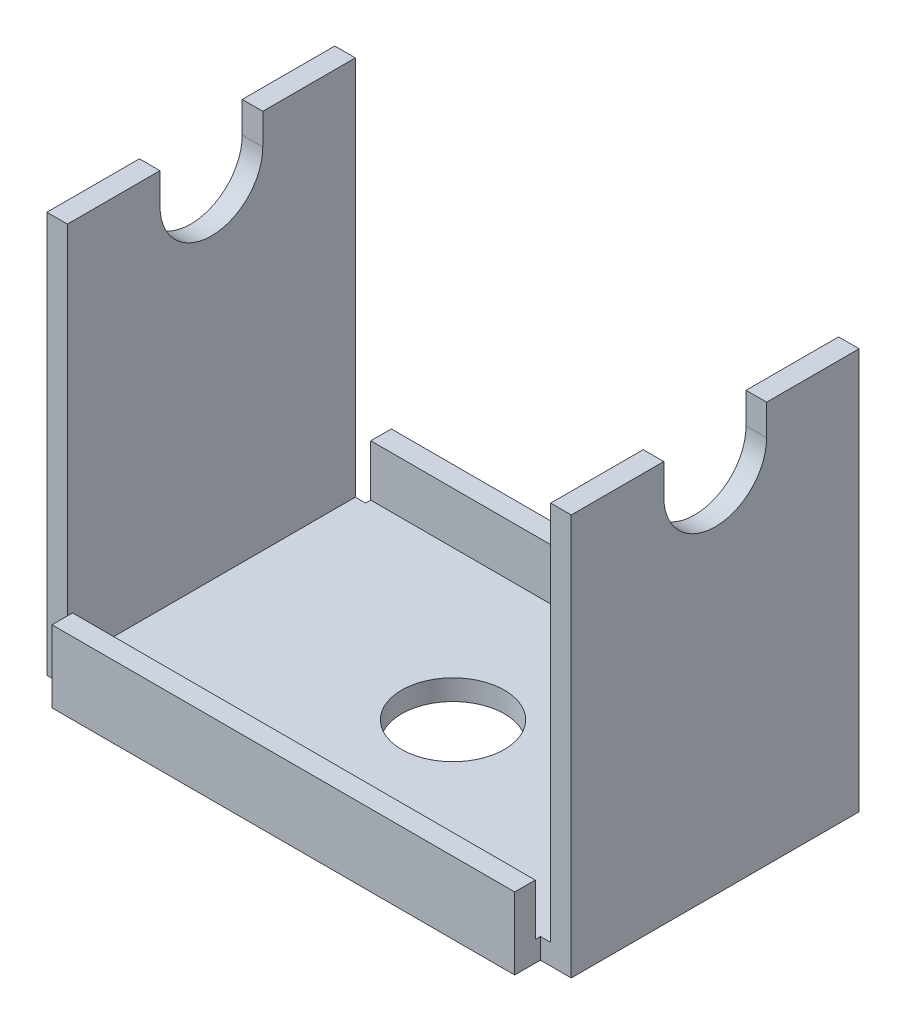
ISO-10303-21;
HEADER;
FILE_DESCRIPTION(('STEP AP214'),'2;1');
FILE_NAME('part.step','',(''),(''),'','','');
FILE_SCHEMA(('AUTOMOTIVE_DESIGN { 1 0 10303 214 1 1 1 1 }'));
ENDSEC;
DATA;
#1=APPLICATION_CONTEXT('core data for automotive mechanical design processes');
#2=APPLICATION_PROTOCOL_DEFINITION('international standard','automotive_design',2000,#1);
#3=PRODUCT_CONTEXT('',#1,'mechanical');
#4=PRODUCT('Part','Part','',(#3));
#5=PRODUCT_RELATED_PRODUCT_CATEGORY('part','',(#4));
#6=PRODUCT_DEFINITION_FORMATION('','',#4);
#7=PRODUCT_DEFINITION_CONTEXT('part definition',#1,'design');
#8=PRODUCT_DEFINITION('design','',#6,#7);
#9=PRODUCT_DEFINITION_SHAPE('','',#8);
#10=(LENGTH_UNIT() NAMED_UNIT(*) SI_UNIT(.MILLI.,.METRE.));
#11=(NAMED_UNIT(*) PLANE_ANGLE_UNIT() SI_UNIT($,.RADIAN.));
#12=(NAMED_UNIT(*) SI_UNIT($,.STERADIAN.) SOLID_ANGLE_UNIT());
#13=UNCERTAINTY_MEASURE_WITH_UNIT(LENGTH_MEASURE(1.E-05),#10,'distance_accuracy_value','');
#14=(GEOMETRIC_REPRESENTATION_CONTEXT(3) GLOBAL_UNCERTAINTY_ASSIGNED_CONTEXT((#13)) GLOBAL_UNIT_ASSIGNED_CONTEXT((#10,
#11,#12)) REPRESENTATION_CONTEXT('',''));
#15=CARTESIAN_POINT('',(0.,0.,0.));
#16=DIRECTION('',(0.,0.,1.));
#17=DIRECTION('',(1.,0.,0.));
#18=AXIS2_PLACEMENT_3D('',#15,#16,#17);
#19=CARTESIAN_POINT('',(-23.5,39.,-14.));
#20=DIRECTION('',(0.,1.,0.));
#21=DIRECTION('',(0.,0.,1.));
#22=AXIS2_PLACEMENT_3D('',#19,#20,#21);
#23=PLANE('',#22);
#24=DIRECTION('',(1.,0.,0.));
#25=VECTOR('',#24,1.);
#26=CARTESIAN_POINT('',(-25.500025,39.,5.));
#27=LINE('',#26,#25);
#28=CARTESIAN_POINT('',(-25.5,39.,5.));
#29=VERTEX_POINT('',#28);
#30=CARTESIAN_POINT('',(-23.5,39.,5.));
#31=VERTEX_POINT('',#30);
#32=EDGE_CURVE('E513',#29,#31,#27,.T.);
#33=ORIENTED_EDGE('',*,*,#32,.F.);
#34=DIRECTION('',(0.,0.,1.));
#35=VECTOR('',#34,1.);
#36=CARTESIAN_POINT('',(-25.5,39.,-14.));
#37=LINE('',#36,#35);
#38=CARTESIAN_POINT('',(-25.5,39.,14.));
#39=VERTEX_POINT('',#38);
#40=EDGE_CURVE('E253',#29,#39,#37,.T.);
#41=ORIENTED_EDGE('',*,*,#40,.T.);
#42=DIRECTION('',(-1.,0.,0.));
#43=VECTOR('',#42,1.);
#44=CARTESIAN_POINT('',(-23.5,39.,14.));
#45=LINE('',#44,#43);
#46=CARTESIAN_POINT('',(-23.5,39.,14.));
#47=VERTEX_POINT('',#46);
#48=EDGE_CURVE('E267',#47,#39,#45,.T.);
#49=ORIENTED_EDGE('',*,*,#48,.F.);
#50=DIRECTION('',(0.,0.,1.));
#51=VECTOR('',#50,1.);
#52=CARTESIAN_POINT('',(-23.5,39.,-14.));
#53=LINE('',#52,#51);
#54=EDGE_CURVE('E305',#31,#47,#53,.T.);
#55=ORIENTED_EDGE('',*,*,#54,.F.);
#56=EDGE_LOOP('',(#33,#41,#49,#55));
#57=FACE_BOUND('',#56,.T.);
#58=ADVANCED_FACE('F31',(#57),#23,.T.);
#59=CARTESIAN_POINT('',(25.5,39.,-14.));
#60=DIRECTION('',(0.,1.,0.));
#61=DIRECTION('',(0.,0.,1.));
#62=AXIS2_PLACEMENT_3D('',#59,#60,#61);
#63=PLANE('',#62);
#64=CARTESIAN_POINT('',(23.5,39.,5.));
#65=VERTEX_POINT('',#64);
#66=CARTESIAN_POINT('',(25.5,39.,5.));
#67=VERTEX_POINT('',#66);
#68=EDGE_CURVE('E346',#65,#67,#27,.T.);
#69=ORIENTED_EDGE('',*,*,#68,.F.);
#70=DIRECTION('',(0.,0.,1.));
#71=VECTOR('',#70,1.);
#72=CARTESIAN_POINT('',(23.5,39.,-14.));
#73=LINE('',#72,#71);
#74=CARTESIAN_POINT('',(23.5,39.,14.));
#75=VERTEX_POINT('',#74);
#76=EDGE_CURVE('E297',#65,#75,#73,.T.);
#77=ORIENTED_EDGE('',*,*,#76,.T.);
#78=DIRECTION('',(-1.,0.,0.));
#79=VECTOR('',#78,1.);
#80=CARTESIAN_POINT('',(25.5,39.,14.));
#81=LINE('',#80,#79);
#82=CARTESIAN_POINT('',(25.5,39.,14.));
#83=VERTEX_POINT('',#82);
#84=EDGE_CURVE('E327',#83,#75,#81,.T.);
#85=ORIENTED_EDGE('',*,*,#84,.F.);
#86=DIRECTION('',(0.,0.,1.));
#87=VECTOR('',#86,1.);
#88=CARTESIAN_POINT('',(25.5,39.,-14.));
#89=LINE('',#88,#87);
#90=EDGE_CURVE('E293',#67,#83,#89,.T.);
#91=ORIENTED_EDGE('',*,*,#90,.F.);
#92=EDGE_LOOP('',(#69,#77,#85,#91));
#93=FACE_BOUND('',#92,.T.);
#94=ADVANCED_FACE('F344',(#93),#63,.T.);
#95=CARTESIAN_POINT('',(-25.5,39.,-14.));
#96=DIRECTION('',(0.,0.,1.));
#97=DIRECTION('',(1.,0.,0.));
#98=AXIS2_PLACEMENT_3D('',#95,#96,#97);
#99=PLANE('',#98);
#100=DIRECTION('',(0.,1.,0.));
#101=VECTOR('',#100,1.);
#102=CARTESIAN_POINT('',(-22.5,2.,-14.));
#103=LINE('',#102,#101);
#104=CARTESIAN_POINT('',(-22.5,0.,-14.));
#105=VERTEX_POINT('',#104);
#106=CARTESIAN_POINT('',(-22.5,2.,-14.));
#107=VERTEX_POINT('',#106);
#108=EDGE_CURVE('E440',#105,#107,#103,.T.);
#109=ORIENTED_EDGE('',*,*,#108,.F.);
#110=DIRECTION('',(1.,0.,0.));
#111=VECTOR('',#110,1.);
#112=CARTESIAN_POINT('',(-25.5,0.,-14.));
#113=LINE('',#112,#111);
#114=CARTESIAN_POINT('',(-25.5,0.,-14.));
#115=VERTEX_POINT('',#114);
#116=EDGE_CURVE('E421',#115,#105,#113,.T.);
#117=ORIENTED_EDGE('',*,*,#116,.F.);
#118=DIRECTION('',(0.,-1.,0.));
#119=VECTOR('',#118,1.);
#120=CARTESIAN_POINT('',(-25.5,39.,-14.));
#121=LINE('',#120,#119);
#122=CARTESIAN_POINT('',(-25.5,39.,-14.));
#123=VERTEX_POINT('',#122);
#124=EDGE_CURVE('E413',#123,#115,#121,.T.);
#125=ORIENTED_EDGE('',*,*,#124,.F.);
#126=DIRECTION('',(-1.,0.,0.));
#127=VECTOR('',#126,1.);
#128=CARTESIAN_POINT('',(-23.5,39.,-14.));
#129=LINE('',#128,#127);
#130=CARTESIAN_POINT('',(-23.5,39.,-14.));
#131=VERTEX_POINT('',#130);
#132=EDGE_CURVE('E313',#131,#123,#129,.T.);
#133=ORIENTED_EDGE('',*,*,#132,.F.);
#134=DIRECTION('',(0.,1.,0.));
#135=VECTOR('',#134,1.);
#136=CARTESIAN_POINT('',(-23.5,2.,-14.));
#137=LINE('',#136,#135);
#138=CARTESIAN_POINT('',(-23.5,2.,-14.));
#139=VERTEX_POINT('',#138);
#140=EDGE_CURVE('E249',#139,#131,#137,.T.);
#141=ORIENTED_EDGE('',*,*,#140,.F.);
#142=DIRECTION('',(-1.,0.,0.));
#143=VECTOR('',#142,1.);
#144=CARTESIAN_POINT('',(23.5,2.,-14.));
#145=LINE('',#144,#143);
#146=EDGE_CURVE('E250',#107,#139,#145,.T.);
#147=ORIENTED_EDGE('',*,*,#146,.F.);
#148=EDGE_LOOP('',(#109,#117,#125,#133,#141,#147));
#149=FACE_BOUND('',#148,.T.);
#150=ADVANCED_FACE('F482',(#149),#99,.F.);
#151=CARTESIAN_POINT('',(-25.5,39.,14.));
#152=DIRECTION('',(0.,0.,1.));
#153=DIRECTION('',(1.,0.,0.));
#154=AXIS2_PLACEMENT_3D('',#151,#152,#153);
#155=PLANE('',#154);
#156=DIRECTION('',(1.,0.,0.));
#157=VECTOR('',#156,1.);
#158=CARTESIAN_POINT('',(-25.5,0.,14.));
#159=LINE('',#158,#157);
#160=CARTESIAN_POINT('',(-25.5,0.,14.));
#161=VERTEX_POINT('',#160);
#162=CARTESIAN_POINT('',(-22.5,0.,14.));
#163=VERTEX_POINT('',#162);
#164=EDGE_CURVE('E283',#161,#163,#159,.T.);
#165=ORIENTED_EDGE('',*,*,#164,.T.);
#166=DIRECTION('',(0.,1.,0.));
#167=VECTOR('',#166,1.);
#168=CARTESIAN_POINT('',(-22.5,2.,14.));
#169=LINE('',#168,#167);
#170=CARTESIAN_POINT('',(-22.5,2.,14.));
#171=VERTEX_POINT('',#170);
#172=EDGE_CURVE('E387',#163,#171,#169,.T.);
#173=ORIENTED_EDGE('',*,*,#172,.T.);
#174=DIRECTION('',(-1.,0.,0.));
#175=VECTOR('',#174,1.);
#176=CARTESIAN_POINT('',(23.5,2.,14.));
#177=LINE('',#176,#175);
#178=CARTESIAN_POINT('',(-23.5,2.,14.));
#179=VERTEX_POINT('',#178);
#180=EDGE_CURVE('E320',#171,#179,#177,.T.);
#181=ORIENTED_EDGE('',*,*,#180,.T.);
#182=DIRECTION('',(0.,1.,0.));
#183=VECTOR('',#182,1.);
#184=CARTESIAN_POINT('',(-23.5,2.,14.));
#185=LINE('',#184,#183);
#186=EDGE_CURVE('E310',#179,#47,#185,.T.);
#187=ORIENTED_EDGE('',*,*,#186,.T.);
#188=ORIENTED_EDGE('',*,*,#48,.T.);
#189=DIRECTION('',(0.,-1.,0.));
#190=VECTOR('',#189,1.);
#191=CARTESIAN_POINT('',(-25.5,39.,14.));
#192=LINE('',#191,#190);
#193=EDGE_CURVE('E270',#39,#161,#192,.T.);
#194=ORIENTED_EDGE('',*,*,#193,.T.);
#195=EDGE_LOOP('',(#165,#173,#181,#187,#188,#194));
#196=FACE_BOUND('',#195,.T.);
#197=ADVANCED_FACE('F500',(#196),#155,.T.);
#198=DIRECTION('',(1.,0.,0.));
#199=VECTOR('',#198,1.);
#200=CARTESIAN_POINT('',(-25.500025,39.,-5.));
#201=LINE('',#200,#199);
#202=CARTESIAN_POINT('',(-25.5,39.,-5.));
#203=VERTEX_POINT('',#202);
#204=CARTESIAN_POINT('',(-23.5,39.,-5.));
#205=VERTEX_POINT('',#204);
#206=EDGE_CURVE('E509',#203,#205,#201,.T.);
#207=ORIENTED_EDGE('',*,*,#206,.T.);
#208=EDGE_CURVE('E306',#131,#205,#53,.T.);
#209=ORIENTED_EDGE('',*,*,#208,.F.);
#210=ORIENTED_EDGE('',*,*,#132,.T.);
#211=EDGE_CURVE('E285',#123,#203,#37,.T.);
#212=ORIENTED_EDGE('',*,*,#211,.T.);
#213=EDGE_LOOP('',(#207,#209,#210,#212));
#214=FACE_BOUND('',#213,.T.);
#215=ADVANCED_FACE('F33',(#214),#23,.T.);
#216=CARTESIAN_POINT('',(-23.5,2.,-14.));
#217=DIRECTION('',(1.,0.,0.));
#218=DIRECTION('',(0.,1.,0.));
#219=AXIS2_PLACEMENT_3D('',#216,#217,#218);
#220=PLANE('',#219);
#221=DIRECTION('',(0.,-1.,0.));
#222=VECTOR('',#221,1.);
#223=CARTESIAN_POINT('',(-23.5,2.,5.));
#224=LINE('',#223,#222);
#225=CARTESIAN_POINT('',(-23.5,36.,5.));
#226=VERTEX_POINT('',#225);
#227=EDGE_CURVE('E527',#31,#226,#224,.T.);
#228=ORIENTED_EDGE('',*,*,#227,.F.);
#229=ORIENTED_EDGE('',*,*,#54,.T.);
#230=ORIENTED_EDGE('',*,*,#186,.F.);
#231=DIRECTION('',(0.,0.,1.));
#232=VECTOR('',#231,1.);
#233=CARTESIAN_POINT('',(-23.5,2.,-14.));
#234=LINE('',#233,#232);
#235=EDGE_CURVE('E302',#139,#179,#234,.T.);
#236=ORIENTED_EDGE('',*,*,#235,.F.);
#237=ORIENTED_EDGE('',*,*,#140,.T.);
#238=ORIENTED_EDGE('',*,*,#208,.T.);
#239=DIRECTION('',(0.,1.,0.));
#240=VECTOR('',#239,1.);
#241=CARTESIAN_POINT('',(-23.5,2.,-5.));
#242=LINE('',#241,#240);
#243=CARTESIAN_POINT('',(-23.5,36.,-5.));
#244=VERTEX_POINT('',#243);
#245=EDGE_CURVE('E522',#244,#205,#242,.T.);
#246=ORIENTED_EDGE('',*,*,#245,.F.);
#247=CARTESIAN_POINT('',(-23.5,36.,0.));
#248=DIRECTION('',(1.,0.,0.));
#249=DIRECTION('',(0.,1.,0.));
#250=AXIS2_PLACEMENT_3D('',#247,#248,#249);
#251=CIRCLE('',#250,5.);
#252=EDGE_CURVE('E444',#226,#244,#251,.T.);
#253=ORIENTED_EDGE('',*,*,#252,.F.);
#254=EDGE_LOOP('',(#228,#229,#230,#236,#237,#238,#246,#253));
#255=FACE_BOUND('',#254,.T.);
#256=ADVANCED_FACE('F487',(#255),#220,.T.);
#257=CARTESIAN_POINT('',(23.5,2.,-14.));
#258=DIRECTION('',(0.,1.,0.));
#259=DIRECTION('',(0.,0.,1.));
#260=AXIS2_PLACEMENT_3D('',#257,#258,#259);
#261=PLANE('',#260);
#262=CARTESIAN_POINT('',(0.,2.,0.));
#263=DIRECTION('',(0.,1.,0.));
#264=DIRECTION('',(0.,0.,1.));
#265=AXIS2_PLACEMENT_3D('',#262,#263,#264);
#266=CIRCLE('',#265,5.);
#267=CARTESIAN_POINT('',(0.,2.,5.));
#268=VERTEX_POINT('',#267);
#269=EDGE_CURVE('E552',#268,#268,#266,.T.);
#270=ORIENTED_EDGE('',*,*,#269,.F.);
#271=EDGE_LOOP('',(#270));
#272=FACE_BOUND('',#271,.T.);
#273=CARTESIAN_POINT('',(23.5,2.,14.));
#274=VERTEX_POINT('',#273);
#275=CARTESIAN_POINT('',(22.5,2.,14.));
#276=VERTEX_POINT('',#275);
#277=EDGE_CURVE('E314',#274,#276,#177,.T.);
#278=ORIENTED_EDGE('',*,*,#277,.F.);
#279=DIRECTION('',(0.,0.,1.));
#280=VECTOR('',#279,1.);
#281=CARTESIAN_POINT('',(23.5,2.,-14.));
#282=LINE('',#281,#280);
#283=CARTESIAN_POINT('',(23.5,2.,-14.));
#284=VERTEX_POINT('',#283);
#285=EDGE_CURVE('E248',#284,#274,#282,.T.);
#286=ORIENTED_EDGE('',*,*,#285,.F.);
#287=CARTESIAN_POINT('',(22.5,2.,-14.));
#288=VERTEX_POINT('',#287);
#289=EDGE_CURVE('E239',#284,#288,#145,.T.);
#290=ORIENTED_EDGE('',*,*,#289,.T.);
#291=DIRECTION('',(0.,0.,-1.));
#292=VECTOR('',#291,1.);
#293=CARTESIAN_POINT('',(22.5,2.,-14.5));
#294=LINE('',#293,#292);
#295=CARTESIAN_POINT('',(22.5,2.,-14.5));
#296=VERTEX_POINT('',#295);
#297=EDGE_CURVE('E221',#288,#296,#294,.T.);
#298=ORIENTED_EDGE('',*,*,#297,.T.);
#299=DIRECTION('',(-1.,0.,0.));
#300=VECTOR('',#299,1.);
#301=CARTESIAN_POINT('',(22.5,2.,-14.5));
#302=LINE('',#301,#300);
#303=CARTESIAN_POINT('',(-22.5,2.,-14.5));
#304=VERTEX_POINT('',#303);
#305=EDGE_CURVE('E232',#296,#304,#302,.T.);
#306=ORIENTED_EDGE('',*,*,#305,.T.);
#307=DIRECTION('',(0.,0.,-1.));
#308=VECTOR('',#307,1.);
#309=CARTESIAN_POINT('',(-22.5,2.,-14.5));
#310=LINE('',#309,#308);
#311=EDGE_CURVE('E244',#107,#304,#310,.T.);
#312=ORIENTED_EDGE('',*,*,#311,.F.);
#313=ORIENTED_EDGE('',*,*,#146,.T.);
#314=ORIENTED_EDGE('',*,*,#235,.T.);
#315=ORIENTED_EDGE('',*,*,#180,.F.);
#316=DIRECTION('',(0.,0.,1.));
#317=VECTOR('',#316,1.);
#318=CARTESIAN_POINT('',(-22.5,2.,14.5));
#319=LINE('',#318,#317);
#320=CARTESIAN_POINT('',(-22.5,2.,14.5));
#321=VERTEX_POINT('',#320);
#322=EDGE_CURVE('E389',#171,#321,#319,.T.);
#323=ORIENTED_EDGE('',*,*,#322,.T.);
#324=DIRECTION('',(-1.,0.,0.));
#325=VECTOR('',#324,1.);
#326=CARTESIAN_POINT('',(22.5,2.,14.5));
#327=LINE('',#326,#325);
#328=CARTESIAN_POINT('',(22.5,2.,14.5));
#329=VERTEX_POINT('',#328);
#330=EDGE_CURVE('E271',#329,#321,#327,.T.);
#331=ORIENTED_EDGE('',*,*,#330,.F.);
#332=DIRECTION('',(0.,0.,1.));
#333=VECTOR('',#332,1.);
#334=CARTESIAN_POINT('',(22.5,2.,14.5));
#335=LINE('',#334,#333);
#336=EDGE_CURVE('E351',#276,#329,#335,.T.);
#337=ORIENTED_EDGE('',*,*,#336,.F.);
#338=EDGE_LOOP('',(#278,#286,#290,#298,#306,#312,#313,#314,#315,#323,#331,#337));
#339=FACE_BOUND('',#338,.T.);
#340=ADVANCED_FACE('F247',(#272,#339),#261,.T.);
#341=CARTESIAN_POINT('',(23.5,39.,-14.));
#342=DIRECTION('',(-1.,0.,0.));
#343=DIRECTION('',(0.,-1.,0.));
#344=AXIS2_PLACEMENT_3D('',#341,#342,#343);
#345=PLANE('',#344);
#346=DIRECTION('',(0.,1.,0.));
#347=VECTOR('',#346,1.);
#348=CARTESIAN_POINT('',(23.5,39.,5.));
#349=LINE('',#348,#347);
#350=CARTESIAN_POINT('',(23.5,36.,5.));
#351=VERTEX_POINT('',#350);
#352=EDGE_CURVE('E525',#351,#65,#349,.T.);
#353=ORIENTED_EDGE('',*,*,#352,.F.);
#354=CARTESIAN_POINT('',(23.5,36.,0.));
#355=DIRECTION('',(-1.,0.,0.));
#356=DIRECTION('',(0.,-1.,0.));
#357=AXIS2_PLACEMENT_3D('',#354,#355,#356);
#358=CIRCLE('',#357,5.);
#359=CARTESIAN_POINT('',(23.5,36.,-5.));
#360=VERTEX_POINT('',#359);
#361=EDGE_CURVE('E529',#360,#351,#358,.T.);
#362=ORIENTED_EDGE('',*,*,#361,.F.);
#363=DIRECTION('',(0.,-1.,0.));
#364=VECTOR('',#363,1.);
#365=CARTESIAN_POINT('',(23.5,39.,-5.));
#366=LINE('',#365,#364);
#367=CARTESIAN_POINT('',(23.5,39.,-5.));
#368=VERTEX_POINT('',#367);
#369=EDGE_CURVE('E520',#368,#360,#366,.T.);
#370=ORIENTED_EDGE('',*,*,#369,.F.);
#371=CARTESIAN_POINT('',(23.5,39.,-14.));
#372=VERTEX_POINT('',#371);
#373=EDGE_CURVE('E298',#372,#368,#73,.T.);
#374=ORIENTED_EDGE('',*,*,#373,.F.);
#375=DIRECTION('',(0.,-1.,0.));
#376=VECTOR('',#375,1.);
#377=CARTESIAN_POINT('',(23.5,39.,-14.));
#378=LINE('',#377,#376);
#379=EDGE_CURVE('E255',#372,#284,#378,.T.);
#380=ORIENTED_EDGE('',*,*,#379,.T.);
#381=ORIENTED_EDGE('',*,*,#285,.T.);
#382=DIRECTION('',(0.,-1.,0.));
#383=VECTOR('',#382,1.);
#384=CARTESIAN_POINT('',(23.5,39.,14.));
#385=LINE('',#384,#383);
#386=EDGE_CURVE('E317',#75,#274,#385,.T.);
#387=ORIENTED_EDGE('',*,*,#386,.F.);
#388=ORIENTED_EDGE('',*,*,#76,.F.);
#389=EDGE_LOOP('',(#353,#362,#370,#374,#380,#381,#387,#388));
#390=FACE_BOUND('',#389,.T.);
#391=ADVANCED_FACE('F349',(#390),#345,.T.);
#392=CARTESIAN_POINT('',(25.5,39.,-5.));
#393=VERTEX_POINT('',#392);
#394=EDGE_CURVE('E511',#368,#393,#201,.T.);
#395=ORIENTED_EDGE('',*,*,#394,.T.);
#396=CARTESIAN_POINT('',(25.5,39.,-14.));
#397=VERTEX_POINT('',#396);
#398=EDGE_CURVE('E294',#397,#393,#89,.T.);
#399=ORIENTED_EDGE('',*,*,#398,.F.);
#400=DIRECTION('',(-1.,0.,0.));
#401=VECTOR('',#400,1.);
#402=CARTESIAN_POINT('',(25.5,39.,-14.));
#403=LINE('',#402,#401);
#404=EDGE_CURVE('E426',#397,#372,#403,.T.);
#405=ORIENTED_EDGE('',*,*,#404,.T.);
#406=ORIENTED_EDGE('',*,*,#373,.T.);
#407=EDGE_LOOP('',(#395,#399,#405,#406));
#408=FACE_BOUND('',#407,.T.);
#409=ADVANCED_FACE('F567',(#408),#63,.T.);
#410=CARTESIAN_POINT('',(25.5,0.,-14.));
#411=DIRECTION('',(1.,0.,0.));
#412=DIRECTION('',(0.,1.,0.));
#413=AXIS2_PLACEMENT_3D('',#410,#411,#412);
#414=PLANE('',#413);
#415=DIRECTION('',(0.,-1.,0.));
#416=VECTOR('',#415,1.);
#417=CARTESIAN_POINT('',(25.5,36.,5.));
#418=LINE('',#417,#416);
#419=CARTESIAN_POINT('',(25.5,36.,5.));
#420=VERTEX_POINT('',#419);
#421=EDGE_CURVE('E341',#67,#420,#418,.T.);
#422=ORIENTED_EDGE('',*,*,#421,.F.);
#423=ORIENTED_EDGE('',*,*,#90,.T.);
#424=DIRECTION('',(0.,1.,0.));
#425=VECTOR('',#424,1.);
#426=CARTESIAN_POINT('',(25.5,0.,14.));
#427=LINE('',#426,#425);
#428=CARTESIAN_POINT('',(25.5,0.,14.));
#429=VERTEX_POINT('',#428);
#430=EDGE_CURVE('E277',#429,#83,#427,.T.);
#431=ORIENTED_EDGE('',*,*,#430,.F.);
#432=DIRECTION('',(0.,0.,1.));
#433=VECTOR('',#432,1.);
#434=CARTESIAN_POINT('',(25.5,0.,-14.));
#435=LINE('',#434,#433);
#436=CARTESIAN_POINT('',(25.5,0.,-14.));
#437=VERTEX_POINT('',#436);
#438=EDGE_CURVE('E290',#437,#429,#435,.T.);
#439=ORIENTED_EDGE('',*,*,#438,.F.);
#440=DIRECTION('',(0.,1.,0.));
#441=VECTOR('',#440,1.);
#442=CARTESIAN_POINT('',(25.5,0.,-14.));
#443=LINE('',#442,#441);
#444=EDGE_CURVE('E418',#437,#397,#443,.T.);
#445=ORIENTED_EDGE('',*,*,#444,.T.);
#446=ORIENTED_EDGE('',*,*,#398,.T.);
#447=DIRECTION('',(0.,1.,0.));
#448=VECTOR('',#447,1.);
#449=CARTESIAN_POINT('',(25.5,36.,-5.));
#450=LINE('',#449,#448);
#451=CARTESIAN_POINT('',(25.5,36.,-5.));
#452=VERTEX_POINT('',#451);
#453=EDGE_CURVE('E548',#452,#393,#450,.T.);
#454=ORIENTED_EDGE('',*,*,#453,.F.);
#455=CARTESIAN_POINT('',(25.5,36.,0.));
#456=DIRECTION('',(1.,0.,0.));
#457=DIRECTION('',(0.,1.,0.));
#458=AXIS2_PLACEMENT_3D('',#455,#456,#457);
#459=CIRCLE('',#458,5.);
#460=EDGE_CURVE('E50',#420,#452,#459,.T.);
#461=ORIENTED_EDGE('',*,*,#460,.F.);
#462=EDGE_LOOP('',(#422,#423,#431,#439,#445,#446,#454,#461));
#463=FACE_BOUND('',#462,.T.);
#464=ADVANCED_FACE('F338',(#463),#414,.T.);
#465=CARTESIAN_POINT('',(-25.5,0.,-14.));
#466=DIRECTION('',(0.,-1.,0.));
#467=DIRECTION('',(0.,0.,-1.));
#468=AXIS2_PLACEMENT_3D('',#465,#466,#467);
#469=PLANE('',#468);
#470=CARTESIAN_POINT('',(0.,0.,0.));
#471=DIRECTION('',(0.,-1.,0.));
#472=DIRECTION('',(0.,0.,-1.));
#473=AXIS2_PLACEMENT_3D('',#470,#471,#472);
#474=CIRCLE('',#473,5.);
#475=CARTESIAN_POINT('',(0.,0.,-5.));
#476=VERTEX_POINT('',#475);
#477=EDGE_CURVE('E35',#476,#476,#474,.T.);
#478=ORIENTED_EDGE('',*,*,#477,.F.);
#479=EDGE_LOOP('',(#478));
#480=FACE_BOUND('',#479,.T.);
#481=ORIENTED_EDGE('',*,*,#164,.F.);
#482=DIRECTION('',(0.,0.,1.));
#483=VECTOR('',#482,1.);
#484=CARTESIAN_POINT('',(-25.5,0.,-14.));
#485=LINE('',#484,#483);
#486=EDGE_CURVE('E288',#115,#161,#485,.T.);
#487=ORIENTED_EDGE('',*,*,#486,.F.);
#488=ORIENTED_EDGE('',*,*,#116,.T.);
#489=DIRECTION('',(0.,0.,1.));
#490=VECTOR('',#489,1.);
#491=CARTESIAN_POINT('',(-22.5,0.,-14.));
#492=LINE('',#491,#490);
#493=CARTESIAN_POINT('',(-22.5,0.,-16.5));
#494=VERTEX_POINT('',#493);
#495=EDGE_CURVE('E443',#494,#105,#492,.T.);
#496=ORIENTED_EDGE('',*,*,#495,.F.);
#497=DIRECTION('',(-1.,0.,0.));
#498=VECTOR('',#497,1.);
#499=CARTESIAN_POINT('',(22.5,0.,-16.5));
#500=LINE('',#499,#498);
#501=CARTESIAN_POINT('',(22.5,0.,-16.5));
#502=VERTEX_POINT('',#501);
#503=EDGE_CURVE('E375',#502,#494,#500,.T.);
#504=ORIENTED_EDGE('',*,*,#503,.F.);
#505=DIRECTION('',(0.,0.,1.));
#506=VECTOR('',#505,1.);
#507=CARTESIAN_POINT('',(22.5,0.,-14.));
#508=LINE('',#507,#506);
#509=CARTESIAN_POINT('',(22.5,0.,-14.));
#510=VERTEX_POINT('',#509);
#511=EDGE_CURVE('E243',#502,#510,#508,.T.);
#512=ORIENTED_EDGE('',*,*,#511,.T.);
#513=EDGE_CURVE('E242',#510,#437,#113,.T.);
#514=ORIENTED_EDGE('',*,*,#513,.T.);
#515=ORIENTED_EDGE('',*,*,#438,.T.);
#516=CARTESIAN_POINT('',(22.5,0.,14.));
#517=VERTEX_POINT('',#516);
#518=EDGE_CURVE('E274',#517,#429,#159,.T.);
#519=ORIENTED_EDGE('',*,*,#518,.F.);
#520=DIRECTION('',(0.,0.,-1.));
#521=VECTOR('',#520,1.);
#522=CARTESIAN_POINT('',(22.5,0.,14.));
#523=LINE('',#522,#521);
#524=CARTESIAN_POINT('',(22.5,0.,16.5));
#525=VERTEX_POINT('',#524);
#526=EDGE_CURVE('E361',#525,#517,#523,.T.);
#527=ORIENTED_EDGE('',*,*,#526,.F.);
#528=DIRECTION('',(-1.,0.,0.));
#529=VECTOR('',#528,1.);
#530=CARTESIAN_POINT('',(22.5,0.,16.5));
#531=LINE('',#530,#529);
#532=CARTESIAN_POINT('',(-22.5,0.,16.5));
#533=VERTEX_POINT('',#532);
#534=EDGE_CURVE('E403',#525,#533,#531,.T.);
#535=ORIENTED_EDGE('',*,*,#534,.T.);
#536=DIRECTION('',(0.,0.,-1.));
#537=VECTOR('',#536,1.);
#538=CARTESIAN_POINT('',(-22.5,0.,14.));
#539=LINE('',#538,#537);
#540=EDGE_CURVE('E362',#533,#163,#539,.T.);
#541=ORIENTED_EDGE('',*,*,#540,.T.);
#542=EDGE_LOOP('',(#481,#487,#488,#496,#504,#512,#514,#515,#519,#527,#535,#541));
#543=FACE_BOUND('',#542,.T.);
#544=ADVANCED_FACE('F428',(#480,#543),#469,.T.);
#545=CARTESIAN_POINT('',(-25.5,39.,-14.));
#546=DIRECTION('',(-1.,0.,0.));
#547=DIRECTION('',(0.,-1.,0.));
#548=AXIS2_PLACEMENT_3D('',#545,#546,#547);
#549=PLANE('',#548);
#550=DIRECTION('',(0.,1.,0.));
#551=VECTOR('',#550,1.);
#552=CARTESIAN_POINT('',(-25.5,39.,5.));
#553=LINE('',#552,#551);
#554=CARTESIAN_POINT('',(-25.5,36.,5.));
#555=VERTEX_POINT('',#554);
#556=EDGE_CURVE('E11',#555,#29,#553,.T.);
#557=ORIENTED_EDGE('',*,*,#556,.F.);
#558=CARTESIAN_POINT('',(-25.5,36.,0.));
#559=DIRECTION('',(1.,0.,0.));
#560=DIRECTION('',(0.,1.,0.));
#561=AXIS2_PLACEMENT_3D('',#558,#559,#560);
#562=CIRCLE('',#561,5.);
#563=CARTESIAN_POINT('',(-25.5,36.,-5.));
#564=VERTEX_POINT('',#563);
#565=EDGE_CURVE('E41',#564,#555,#562,.F.);
#566=ORIENTED_EDGE('',*,*,#565,.F.);
#567=DIRECTION('',(0.,-1.,0.));
#568=VECTOR('',#567,1.);
#569=CARTESIAN_POINT('',(-25.5,39.,-5.));
#570=LINE('',#569,#568);
#571=EDGE_CURVE('E309',#203,#564,#570,.T.);
#572=ORIENTED_EDGE('',*,*,#571,.F.);
#573=ORIENTED_EDGE('',*,*,#211,.F.);
#574=ORIENTED_EDGE('',*,*,#124,.T.);
#575=ORIENTED_EDGE('',*,*,#486,.T.);
#576=ORIENTED_EDGE('',*,*,#193,.F.);
#577=ORIENTED_EDGE('',*,*,#40,.F.);
#578=EDGE_LOOP('',(#557,#566,#572,#573,#574,#575,#576,#577));
#579=FACE_BOUND('',#578,.T.);
#580=ADVANCED_FACE('F505',(#579),#549,.T.);
#581=ORIENTED_EDGE('',*,*,#513,.F.);
#582=DIRECTION('',(0.,1.,0.));
#583=VECTOR('',#582,1.);
#584=CARTESIAN_POINT('',(22.5,2.,-14.));
#585=LINE('',#584,#583);
#586=EDGE_CURVE('E225',#510,#288,#585,.T.);
#587=ORIENTED_EDGE('',*,*,#586,.T.);
#588=ORIENTED_EDGE('',*,*,#289,.F.);
#589=ORIENTED_EDGE('',*,*,#379,.F.);
#590=ORIENTED_EDGE('',*,*,#404,.F.);
#591=ORIENTED_EDGE('',*,*,#444,.F.);
#592=EDGE_LOOP('',(#581,#587,#588,#589,#590,#591));
#593=FACE_BOUND('',#592,.T.);
#594=ADVANCED_FACE('F237',(#593),#99,.F.);
#595=DIRECTION('',(0.,1.,0.));
#596=VECTOR('',#595,1.);
#597=CARTESIAN_POINT('',(22.5,2.,14.));
#598=LINE('',#597,#596);
#599=EDGE_CURVE('E357',#517,#276,#598,.T.);
#600=ORIENTED_EDGE('',*,*,#599,.F.);
#601=ORIENTED_EDGE('',*,*,#518,.T.);
#602=ORIENTED_EDGE('',*,*,#430,.T.);
#603=ORIENTED_EDGE('',*,*,#84,.T.);
#604=ORIENTED_EDGE('',*,*,#386,.T.);
#605=ORIENTED_EDGE('',*,*,#277,.T.);
#606=EDGE_LOOP('',(#600,#601,#602,#603,#604,#605));
#607=FACE_BOUND('',#606,.T.);
#608=ADVANCED_FACE('F333',(#607),#155,.T.);
#609=CARTESIAN_POINT('',(22.5,7.,14.5));
#610=DIRECTION('',(0.,0.,1.));
#611=DIRECTION('',(1.,0.,0.));
#612=AXIS2_PLACEMENT_3D('',#609,#610,#611);
#613=PLANE('',#612);
#614=DIRECTION('',(0.,1.,0.));
#615=VECTOR('',#614,1.);
#616=CARTESIAN_POINT('',(-22.5,7.,14.5));
#617=LINE('',#616,#615);
#618=CARTESIAN_POINT('',(-22.5,7.,14.5));
#619=VERTEX_POINT('',#618);
#620=EDGE_CURVE('E384',#321,#619,#617,.T.);
#621=ORIENTED_EDGE('',*,*,#620,.T.);
#622=DIRECTION('',(-1.,0.,0.));
#623=VECTOR('',#622,1.);
#624=CARTESIAN_POINT('',(22.5,7.,14.5));
#625=LINE('',#624,#623);
#626=CARTESIAN_POINT('',(22.5,7.,14.5));
#627=VERTEX_POINT('',#626);
#628=EDGE_CURVE('E408',#627,#619,#625,.T.);
#629=ORIENTED_EDGE('',*,*,#628,.F.);
#630=DIRECTION('',(0.,1.,0.));
#631=VECTOR('',#630,1.);
#632=CARTESIAN_POINT('',(22.5,7.,14.5));
#633=LINE('',#632,#631);
#634=EDGE_CURVE('E356',#329,#627,#633,.T.);
#635=ORIENTED_EDGE('',*,*,#634,.F.);
#636=ORIENTED_EDGE('',*,*,#330,.T.);
#637=EDGE_LOOP('',(#621,#629,#635,#636));
#638=FACE_BOUND('',#637,.T.);
#639=ADVANCED_FACE('F586',(#638),#613,.F.);
#640=CARTESIAN_POINT('',(22.5,7.,16.5));
#641=DIRECTION('',(0.,-1.,0.));
#642=DIRECTION('',(0.,0.,-1.));
#643=AXIS2_PLACEMENT_3D('',#640,#641,#642);
#644=PLANE('',#643);
#645=DIRECTION('',(0.,0.,1.));
#646=VECTOR('',#645,1.);
#647=CARTESIAN_POINT('',(-22.5,7.,16.5));
#648=LINE('',#647,#646);
#649=CARTESIAN_POINT('',(-22.5,7.,16.5));
#650=VERTEX_POINT('',#649);
#651=EDGE_CURVE('E392',#619,#650,#648,.T.);
#652=ORIENTED_EDGE('',*,*,#651,.T.);
#653=DIRECTION('',(-1.,0.,0.));
#654=VECTOR('',#653,1.);
#655=CARTESIAN_POINT('',(22.5,7.,16.5));
#656=LINE('',#655,#654);
#657=CARTESIAN_POINT('',(22.5,7.,16.5));
#658=VERTEX_POINT('',#657);
#659=EDGE_CURVE('E406',#658,#650,#656,.T.);
#660=ORIENTED_EDGE('',*,*,#659,.F.);
#661=DIRECTION('',(0.,0.,1.));
#662=VECTOR('',#661,1.);
#663=CARTESIAN_POINT('',(22.5,7.,16.5));
#664=LINE('',#663,#662);
#665=EDGE_CURVE('E378',#627,#658,#664,.T.);
#666=ORIENTED_EDGE('',*,*,#665,.F.);
#667=ORIENTED_EDGE('',*,*,#628,.T.);
#668=EDGE_LOOP('',(#652,#660,#666,#667));
#669=FACE_BOUND('',#668,.T.);
#670=ADVANCED_FACE('F591',(#669),#644,.F.);
#671=CARTESIAN_POINT('',(22.5,0.,16.5));
#672=DIRECTION('',(0.,0.,-1.));
#673=DIRECTION('',(0.,1.,0.));
#674=AXIS2_PLACEMENT_3D('',#671,#672,#673);
#675=PLANE('',#674);
#676=DIRECTION('',(0.,-1.,0.));
#677=VECTOR('',#676,1.);
#678=CARTESIAN_POINT('',(-22.5,0.,16.5));
#679=LINE('',#678,#677);
#680=EDGE_CURVE('E365',#650,#533,#679,.T.);
#681=ORIENTED_EDGE('',*,*,#680,.T.);
#682=ORIENTED_EDGE('',*,*,#534,.F.);
#683=DIRECTION('',(0.,-1.,0.));
#684=VECTOR('',#683,1.);
#685=CARTESIAN_POINT('',(22.5,0.,16.5));
#686=LINE('',#685,#684);
#687=EDGE_CURVE('E380',#658,#525,#686,.T.);
#688=ORIENTED_EDGE('',*,*,#687,.F.);
#689=ORIENTED_EDGE('',*,*,#659,.T.);
#690=EDGE_LOOP('',(#681,#682,#688,#689));
#691=FACE_BOUND('',#690,.T.);
#692=ADVANCED_FACE('F497',(#691),#675,.F.);
#693=CARTESIAN_POINT('',(22.5,0.,14.));
#694=DIRECTION('',(-1.,0.,0.));
#695=DIRECTION('',(0.,0.,1.));
#696=AXIS2_PLACEMENT_3D('',#693,#694,#695);
#697=PLANE('',#696);
#698=ORIENTED_EDGE('',*,*,#599,.T.);
#699=ORIENTED_EDGE('',*,*,#336,.T.);
#700=ORIENTED_EDGE('',*,*,#634,.T.);
#701=ORIENTED_EDGE('',*,*,#665,.T.);
#702=ORIENTED_EDGE('',*,*,#687,.T.);
#703=ORIENTED_EDGE('',*,*,#526,.T.);
#704=EDGE_LOOP('',(#698,#699,#700,#701,#702,#703));
#705=FACE_BOUND('',#704,.T.);
#706=ADVANCED_FACE('F359',(#705),#697,.F.);
#707=CARTESIAN_POINT('',(-22.5,0.,14.));
#708=DIRECTION('',(-1.,0.,0.));
#709=DIRECTION('',(0.,0.,1.));
#710=AXIS2_PLACEMENT_3D('',#707,#708,#709);
#711=PLANE('',#710);
#712=ORIENTED_EDGE('',*,*,#172,.F.);
#713=ORIENTED_EDGE('',*,*,#540,.F.);
#714=ORIENTED_EDGE('',*,*,#680,.F.);
#715=ORIENTED_EDGE('',*,*,#651,.F.);
#716=ORIENTED_EDGE('',*,*,#620,.F.);
#717=ORIENTED_EDGE('',*,*,#322,.F.);
#718=EDGE_LOOP('',(#712,#713,#714,#715,#716,#717));
#719=FACE_BOUND('',#718,.T.);
#720=ADVANCED_FACE('F492',(#719),#711,.T.);
#721=CARTESIAN_POINT('',(22.5,0.,-16.5));
#722=DIRECTION('',(0.,0.,-1.));
#723=DIRECTION('',(0.,1.,0.));
#724=AXIS2_PLACEMENT_3D('',#721,#722,#723);
#725=PLANE('',#724);
#726=DIRECTION('',(0.,-1.,0.));
#727=VECTOR('',#726,1.);
#728=CARTESIAN_POINT('',(-22.5,0.,-16.5));
#729=LINE('',#728,#727);
#730=CARTESIAN_POINT('',(-22.5,7.,-16.5));
#731=VERTEX_POINT('',#730);
#732=EDGE_CURVE('E450',#731,#494,#729,.T.);
#733=ORIENTED_EDGE('',*,*,#732,.F.);
#734=DIRECTION('',(-1.,0.,0.));
#735=VECTOR('',#734,1.);
#736=CARTESIAN_POINT('',(22.5,7.,-16.5));
#737=LINE('',#736,#735);
#738=CARTESIAN_POINT('',(22.5,7.,-16.5));
#739=VERTEX_POINT('',#738);
#740=EDGE_CURVE('E461',#739,#731,#737,.T.);
#741=ORIENTED_EDGE('',*,*,#740,.F.);
#742=DIRECTION('',(0.,-1.,0.));
#743=VECTOR('',#742,1.);
#744=CARTESIAN_POINT('',(22.5,0.,-16.5));
#745=LINE('',#744,#743);
#746=EDGE_CURVE('E431',#739,#502,#745,.T.);
#747=ORIENTED_EDGE('',*,*,#746,.T.);
#748=ORIENTED_EDGE('',*,*,#503,.T.);
#749=EDGE_LOOP('',(#733,#741,#747,#748));
#750=FACE_BOUND('',#749,.T.);
#751=ADVANCED_FACE('F467',(#750),#725,.T.);
#752=CARTESIAN_POINT('',(22.5,7.,-16.5));
#753=DIRECTION('',(0.,1.,0.));
#754=DIRECTION('',(0.,0.,1.));
#755=AXIS2_PLACEMENT_3D('',#752,#753,#754);
#756=PLANE('',#755);
#757=DIRECTION('',(0.,0.,-1.));
#758=VECTOR('',#757,1.);
#759=CARTESIAN_POINT('',(-22.5,7.,-16.5));
#760=LINE('',#759,#758);
#761=CARTESIAN_POINT('',(-22.5,7.,-14.5));
#762=VERTEX_POINT('',#761);
#763=EDGE_CURVE('E453',#762,#731,#760,.T.);
#764=ORIENTED_EDGE('',*,*,#763,.F.);
#765=DIRECTION('',(-1.,0.,0.));
#766=VECTOR('',#765,1.);
#767=CARTESIAN_POINT('',(22.5,7.,-14.5));
#768=LINE('',#767,#766);
#769=CARTESIAN_POINT('',(22.5,7.,-14.5));
#770=VERTEX_POINT('',#769);
#771=EDGE_CURVE('E460',#770,#762,#768,.T.);
#772=ORIENTED_EDGE('',*,*,#771,.F.);
#773=DIRECTION('',(0.,0.,-1.));
#774=VECTOR('',#773,1.);
#775=CARTESIAN_POINT('',(22.5,7.,-16.5));
#776=LINE('',#775,#774);
#777=EDGE_CURVE('E433',#770,#739,#776,.T.);
#778=ORIENTED_EDGE('',*,*,#777,.T.);
#779=ORIENTED_EDGE('',*,*,#740,.T.);
#780=EDGE_LOOP('',(#764,#772,#778,#779));
#781=FACE_BOUND('',#780,.T.);
#782=ADVANCED_FACE('F473',(#781),#756,.T.);
#783=CARTESIAN_POINT('',(22.5,7.,-14.5));
#784=DIRECTION('',(0.,0.,1.));
#785=DIRECTION('',(1.,0.,0.));
#786=AXIS2_PLACEMENT_3D('',#783,#784,#785);
#787=PLANE('',#786);
#788=DIRECTION('',(0.,1.,0.));
#789=VECTOR('',#788,1.);
#790=CARTESIAN_POINT('',(-22.5,7.,-14.5));
#791=LINE('',#790,#789);
#792=EDGE_CURVE('E456',#304,#762,#791,.T.);
#793=ORIENTED_EDGE('',*,*,#792,.F.);
#794=ORIENTED_EDGE('',*,*,#305,.F.);
#795=DIRECTION('',(0.,1.,0.));
#796=VECTOR('',#795,1.);
#797=CARTESIAN_POINT('',(22.5,7.,-14.5));
#798=LINE('',#797,#796);
#799=EDGE_CURVE('E229',#296,#770,#798,.T.);
#800=ORIENTED_EDGE('',*,*,#799,.T.);
#801=ORIENTED_EDGE('',*,*,#771,.T.);
#802=EDGE_LOOP('',(#793,#794,#800,#801));
#803=FACE_BOUND('',#802,.T.);
#804=ADVANCED_FACE('F475',(#803),#787,.T.);
#805=CARTESIAN_POINT('',(22.5,0.,-14.));
#806=DIRECTION('',(-1.,0.,0.));
#807=DIRECTION('',(0.,0.,-1.));
#808=AXIS2_PLACEMENT_3D('',#805,#806,#807);
#809=PLANE('',#808);
#810=ORIENTED_EDGE('',*,*,#586,.F.);
#811=ORIENTED_EDGE('',*,*,#511,.F.);
#812=ORIENTED_EDGE('',*,*,#746,.F.);
#813=ORIENTED_EDGE('',*,*,#777,.F.);
#814=ORIENTED_EDGE('',*,*,#799,.F.);
#815=ORIENTED_EDGE('',*,*,#297,.F.);
#816=EDGE_LOOP('',(#810,#811,#812,#813,#814,#815));
#817=FACE_BOUND('',#816,.T.);
#818=ADVANCED_FACE('F223',(#817),#809,.F.);
#819=CARTESIAN_POINT('',(-22.5,0.,-14.));
#820=DIRECTION('',(-1.,0.,0.));
#821=DIRECTION('',(0.,0.,-1.));
#822=AXIS2_PLACEMENT_3D('',#819,#820,#821);
#823=PLANE('',#822);
#824=ORIENTED_EDGE('',*,*,#108,.T.);
#825=ORIENTED_EDGE('',*,*,#311,.T.);
#826=ORIENTED_EDGE('',*,*,#792,.T.);
#827=ORIENTED_EDGE('',*,*,#763,.T.);
#828=ORIENTED_EDGE('',*,*,#732,.T.);
#829=ORIENTED_EDGE('',*,*,#495,.T.);
#830=EDGE_LOOP('',(#824,#825,#826,#827,#828,#829));
#831=FACE_BOUND('',#830,.T.);
#832=ADVANCED_FACE('F470',(#831),#823,.T.);
#833=CARTESIAN_POINT('',(-25.500025,36.,-5.));
#834=DIRECTION('',(0.,0.,-1.));
#835=DIRECTION('',(-1.,0.,0.));
#836=AXIS2_PLACEMENT_3D('',#833,#834,#835);
#837=PLANE('',#836);
#838=ORIENTED_EDGE('',*,*,#245,.T.);
#839=ORIENTED_EDGE('',*,*,#206,.F.);
#840=ORIENTED_EDGE('',*,*,#571,.T.);
#841=DIRECTION('',(1.,0.,0.));
#842=VECTOR('',#841,1.);
#843=CARTESIAN_POINT('',(-25.500025,36.,-5.));
#844=LINE('',#843,#842);
#845=EDGE_CURVE('E63',#564,#244,#844,.T.);
#846=ORIENTED_EDGE('',*,*,#845,.T.);
#847=EDGE_LOOP('',(#838,#839,#840,#846));
#848=FACE_BOUND('',#847,.T.);
#849=ADVANCED_FACE('F535',(#848),#837,.F.);
#850=CARTESIAN_POINT('',(-25.500025,36.,5.));
#851=DIRECTION('',(0.,0.,1.));
#852=DIRECTION('',(1.,0.,0.));
#853=AXIS2_PLACEMENT_3D('',#850,#851,#852);
#854=PLANE('',#853);
#855=ORIENTED_EDGE('',*,*,#227,.T.);
#856=DIRECTION('',(1.,0.,0.));
#857=VECTOR('',#856,1.);
#858=CARTESIAN_POINT('',(-25.500025,36.,5.));
#859=LINE('',#858,#857);
#860=EDGE_CURVE('E523',#555,#226,#859,.T.);
#861=ORIENTED_EDGE('',*,*,#860,.F.);
#862=ORIENTED_EDGE('',*,*,#556,.T.);
#863=ORIENTED_EDGE('',*,*,#32,.T.);
#864=EDGE_LOOP('',(#855,#861,#862,#863));
#865=FACE_BOUND('',#864,.T.);
#866=ADVANCED_FACE('F543',(#865),#854,.F.);
#867=CARTESIAN_POINT('',(-25.500025,36.,0.));
#868=DIRECTION('',(1.,0.,0.));
#869=DIRECTION('',(0.,1.,0.));
#870=AXIS2_PLACEMENT_3D('',#867,#868,#869);
#871=CYLINDRICAL_SURFACE('',#870,5.);
#872=ORIENTED_EDGE('',*,*,#252,.T.);
#873=ORIENTED_EDGE('',*,*,#845,.F.);
#874=ORIENTED_EDGE('',*,*,#565,.T.);
#875=ORIENTED_EDGE('',*,*,#860,.T.);
#876=EDGE_LOOP('',(#872,#873,#874,#875));
#877=FACE_BOUND('',#876,.T.);
#878=ADVANCED_FACE('F534',(#877),#871,.F.);
#879=ORIENTED_EDGE('',*,*,#361,.T.);
#880=EDGE_CURVE('E71',#351,#420,#859,.T.);
#881=ORIENTED_EDGE('',*,*,#880,.T.);
#882=ORIENTED_EDGE('',*,*,#460,.T.);
#883=EDGE_CURVE('E518',#360,#452,#844,.T.);
#884=ORIENTED_EDGE('',*,*,#883,.F.);
#885=EDGE_LOOP('',(#879,#881,#882,#884));
#886=FACE_BOUND('',#885,.T.);
#887=ADVANCED_FACE('F614',(#886),#871,.F.);
#888=ORIENTED_EDGE('',*,*,#352,.T.);
#889=ORIENTED_EDGE('',*,*,#68,.T.);
#890=ORIENTED_EDGE('',*,*,#421,.T.);
#891=ORIENTED_EDGE('',*,*,#880,.F.);
#892=EDGE_LOOP('',(#888,#889,#890,#891));
#893=FACE_BOUND('',#892,.T.);
#894=ADVANCED_FACE('F617',(#893),#854,.F.);
#895=ORIENTED_EDGE('',*,*,#369,.T.);
#896=ORIENTED_EDGE('',*,*,#883,.T.);
#897=ORIENTED_EDGE('',*,*,#453,.T.);
#898=ORIENTED_EDGE('',*,*,#394,.F.);
#899=EDGE_LOOP('',(#895,#896,#897,#898));
#900=FACE_BOUND('',#899,.T.);
#901=ADVANCED_FACE('F618',(#900),#837,.F.);
#902=CARTESIAN_POINT('',(0.,-5.00000000001367E-05,0.));
#903=DIRECTION('',(0.,1.,0.));
#904=DIRECTION('',(0.,0.,1.));
#905=AXIS2_PLACEMENT_3D('',#902,#903,#904);
#906=CYLINDRICAL_SURFACE('',#905,5.);
#907=ORIENTED_EDGE('',*,*,#477,.T.);
#908=EDGE_LOOP('',(#907));
#909=FACE_BOUND('',#908,.T.);
#910=ORIENTED_EDGE('',*,*,#269,.T.);
#911=EDGE_LOOP('',(#910));
#912=FACE_BOUND('',#911,.T.);
#913=ADVANCED_FACE('F559',(#909,#912),#906,.F.);
#914=CLOSED_SHELL('',(#58,#94,#150,#197,#215,#256,#340,#391,#409,#464,#544,#580,#594,#608,#639,
#670,#692,#706,#720,#751,#782,#804,#818,#832,#849,#866,#878,#887,#894,#901,#913));
#915=MANIFOLD_SOLID_BREP('B2',#914);
#916=ADVANCED_BREP_SHAPE_REPRESENTATION('',(#18,#915),#14);
#917=SHAPE_DEFINITION_REPRESENTATION(#9,#916);
ENDSEC;
END-ISO-10303-21;
